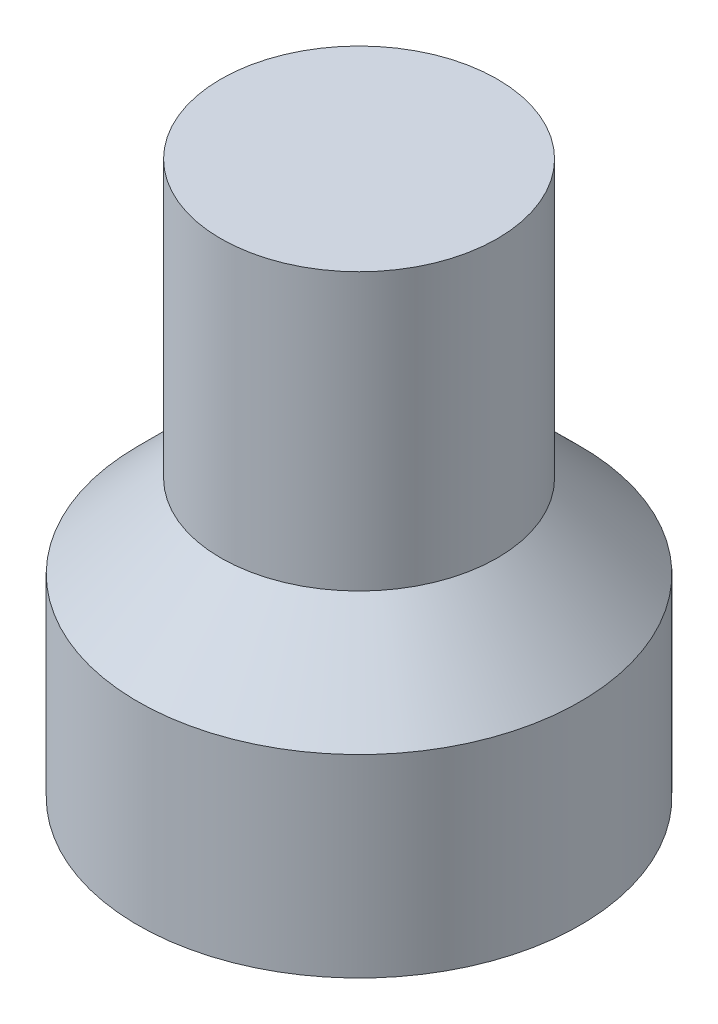
ISO-10303-21;
HEADER;
FILE_DESCRIPTION(('STEP AP214'),'2;1');
FILE_NAME('part.step','',(''),(''),'','','');
FILE_SCHEMA(('AUTOMOTIVE_DESIGN { 1 0 10303 214 1 1 1 1 }'));
ENDSEC;
DATA;
#1=APPLICATION_CONTEXT('core data for automotive mechanical design processes');
#2=APPLICATION_PROTOCOL_DEFINITION('international standard','automotive_design',2000,#1);
#3=PRODUCT_CONTEXT('',#1,'mechanical');
#4=PRODUCT('Part','Part','',(#3));
#5=PRODUCT_RELATED_PRODUCT_CATEGORY('part','',(#4));
#6=PRODUCT_DEFINITION_FORMATION('','',#4);
#7=PRODUCT_DEFINITION_CONTEXT('part definition',#1,'design');
#8=PRODUCT_DEFINITION('design','',#6,#7);
#9=PRODUCT_DEFINITION_SHAPE('','',#8);
#10=(LENGTH_UNIT() NAMED_UNIT(*) SI_UNIT(.MILLI.,.METRE.));
#11=(NAMED_UNIT(*) PLANE_ANGLE_UNIT() SI_UNIT($,.RADIAN.));
#12=(NAMED_UNIT(*) SI_UNIT($,.STERADIAN.) SOLID_ANGLE_UNIT());
#13=UNCERTAINTY_MEASURE_WITH_UNIT(LENGTH_MEASURE(1.E-05),#10,'distance_accuracy_value','');
#14=(GEOMETRIC_REPRESENTATION_CONTEXT(3) GLOBAL_UNCERTAINTY_ASSIGNED_CONTEXT((#13)) GLOBAL_UNIT_ASSIGNED_CONTEXT((#10,
#11,#12)) REPRESENTATION_CONTEXT('',''));
#15=CARTESIAN_POINT('',(0.,0.,0.));
#16=DIRECTION('',(0.,0.,1.));
#17=DIRECTION('',(1.,0.,0.));
#18=AXIS2_PLACEMENT_3D('',#15,#16,#17);
#19=CARTESIAN_POINT('',(0.,-10.,0.));
#20=DIRECTION('',(0.,-1.,0.));
#21=DIRECTION('',(1.,0.,0.));
#22=AXIS2_PLACEMENT_3D('',#19,#20,#21);
#23=PLANE('',#22);
#24=CARTESIAN_POINT('',(0.,-10.,0.));
#25=DIRECTION('',(0.,-1.,0.));
#26=DIRECTION('',(1.,0.,0.));
#27=AXIS2_PLACEMENT_3D('',#24,#25,#26);
#28=CIRCLE('',#27,5.1);
#29=CARTESIAN_POINT('',(5.1,-10.,0.));
#30=VERTEX_POINT('',#29);
#31=EDGE_CURVE('E65',#30,#30,#28,.T.);
#32=ORIENTED_EDGE('',*,*,#31,.F.);
#33=EDGE_LOOP('',(#32));
#34=FACE_BOUND('',#33,.T.);
#35=CARTESIAN_POINT('',(0.,-10.,0.));
#36=DIRECTION('',(0.,1.,0.));
#37=DIRECTION('',(-1.,0.,0.));
#38=AXIS2_PLACEMENT_3D('',#35,#36,#37);
#39=CIRCLE('',#38,8.);
#40=CARTESIAN_POINT('',(-8.,-10.,0.));
#41=VERTEX_POINT('',#40);
#42=EDGE_CURVE('E51',#41,#41,#39,.T.);
#43=ORIENTED_EDGE('',*,*,#42,.F.);
#44=EDGE_LOOP('',(#43));
#45=FACE_BOUND('',#44,.T.);
#46=ADVANCED_FACE('F43',(#34,#45),#23,.T.);
#47=CARTESIAN_POINT('',(0.,10.,0.));
#48=DIRECTION('',(0.,1.,0.));
#49=DIRECTION('',(-1.,0.,0.));
#50=AXIS2_PLACEMENT_3D('',#47,#48,#49);
#51=CYLINDRICAL_SURFACE('',#50,8.);
#52=CARTESIAN_POINT('',(0.,-3.00000000000001,0.));
#53=DIRECTION('',(0.,1.,0.));
#54=DIRECTION('',(-1.,0.,0.));
#55=AXIS2_PLACEMENT_3D('',#52,#53,#54);
#56=CIRCLE('',#55,8.);
#57=CARTESIAN_POINT('',(-8.,-3.00000000000001,0.));
#58=VERTEX_POINT('',#57);
#59=EDGE_CURVE('E11',#58,#58,#56,.F.);
#60=ORIENTED_EDGE('',*,*,#59,.T.);
#61=EDGE_LOOP('',(#60));
#62=FACE_BOUND('',#61,.T.);
#63=ORIENTED_EDGE('',*,*,#42,.T.);
#64=EDGE_LOOP('',(#63));
#65=FACE_BOUND('',#64,.T.);
#66=ADVANCED_FACE('F90',(#62,#65),#51,.T.);
#67=CARTESIAN_POINT('',(0.,10.,0.));
#68=DIRECTION('',(0.,1.,0.));
#69=DIRECTION('',(-1.,0.,0.));
#70=AXIS2_PLACEMENT_3D('',#67,#68,#69);
#71=CYLINDRICAL_SURFACE('',#70,5.);
#72=CARTESIAN_POINT('',(0.,0.,0.));
#73=DIRECTION('',(0.,1.,0.));
#74=DIRECTION('',(-1.,0.,0.));
#75=AXIS2_PLACEMENT_3D('',#72,#73,#74);
#76=CIRCLE('',#75,5.);
#77=CARTESIAN_POINT('',(-5.,0.,0.));
#78=VERTEX_POINT('',#77);
#79=EDGE_CURVE('E83',#78,#78,#76,.T.);
#80=ORIENTED_EDGE('',*,*,#79,.T.);
#81=EDGE_LOOP('',(#80));
#82=FACE_BOUND('',#81,.T.);
#83=CARTESIAN_POINT('',(0.,10.,0.));
#84=DIRECTION('',(0.,1.,0.));
#85=DIRECTION('',(-1.,0.,0.));
#86=AXIS2_PLACEMENT_3D('',#83,#84,#85);
#87=CIRCLE('',#86,5.);
#88=CARTESIAN_POINT('',(-5.,10.,0.));
#89=VERTEX_POINT('',#88);
#90=EDGE_CURVE('E78',#89,#89,#87,.T.);
#91=ORIENTED_EDGE('',*,*,#90,.F.);
#92=EDGE_LOOP('',(#91));
#93=FACE_BOUND('',#92,.T.);
#94=ADVANCED_FACE('F97',(#82,#93),#71,.T.);
#95=CARTESIAN_POINT('',(0.,10.,0.));
#96=DIRECTION('',(0.,1.,0.));
#97=DIRECTION('',(-1.,0.,0.));
#98=AXIS2_PLACEMENT_3D('',#95,#96,#97);
#99=PLANE('',#98);
#100=ORIENTED_EDGE('',*,*,#90,.T.);
#101=EDGE_LOOP('',(#100));
#102=FACE_BOUND('',#101,.T.);
#103=ADVANCED_FACE('F104',(#102),#99,.T.);
#104=CARTESIAN_POINT('',(0.,0.,0.));
#105=DIRECTION('',(0.,-1.,0.));
#106=DIRECTION('',(1.,0.,0.));
#107=AXIS2_PLACEMENT_3D('',#104,#105,#106);
#108=CONICAL_SURFACE('',#107,5.00000000000001,0.785398163397446);
#109=ORIENTED_EDGE('',*,*,#59,.F.);
#110=EDGE_LOOP('',(#109));
#111=FACE_BOUND('',#110,.T.);
#112=ORIENTED_EDGE('',*,*,#79,.F.);
#113=EDGE_LOOP('',(#112));
#114=FACE_BOUND('',#113,.T.);
#115=ADVANCED_FACE('F45',(#111,#114),#108,.T.);
#116=CARTESIAN_POINT('',(0.,-4.9,0.));
#117=DIRECTION('',(0.,-1.,0.));
#118=DIRECTION('',(1.,0.,0.));
#119=AXIS2_PLACEMENT_3D('',#116,#117,#118);
#120=CYLINDRICAL_SURFACE('',#119,5.1);
#121=CARTESIAN_POINT('',(0.,-4.9,0.));
#122=DIRECTION('',(0.,-1.,0.));
#123=DIRECTION('',(1.,0.,0.));
#124=AXIS2_PLACEMENT_3D('',#121,#122,#123);
#125=CIRCLE('',#124,5.1);
#126=CARTESIAN_POINT('',(5.1,-4.9,0.));
#127=VERTEX_POINT('',#126);
#128=EDGE_CURVE('E71',#127,#127,#125,.T.);
#129=ORIENTED_EDGE('',*,*,#128,.F.);
#130=EDGE_LOOP('',(#129));
#131=FACE_BOUND('',#130,.T.);
#132=ORIENTED_EDGE('',*,*,#31,.T.);
#133=EDGE_LOOP('',(#132));
#134=FACE_BOUND('',#133,.T.);
#135=ADVANCED_FACE('F109',(#131,#134),#120,.F.);
#136=CARTESIAN_POINT('',(0.,-4.9,0.));
#137=DIRECTION('',(0.,-1.,0.));
#138=DIRECTION('',(1.,0.,0.));
#139=AXIS2_PLACEMENT_3D('',#136,#137,#138);
#140=PLANE('',#139);
#141=CARTESIAN_POINT('',(0.,-4.9,0.));
#142=DIRECTION('',(0.,-1.,0.));
#143=DIRECTION('',(0.,0.,-1.));
#144=AXIS2_PLACEMENT_3D('',#141,#142,#143);
#145=CIRCLE('',#144,1.25);
#146=CARTESIAN_POINT('',(0.,-4.9,-1.25));
#147=VERTEX_POINT('',#146);
#148=EDGE_CURVE('E66',#147,#147,#145,.T.);
#149=ORIENTED_EDGE('',*,*,#148,.F.);
#150=EDGE_LOOP('',(#149));
#151=FACE_BOUND('',#150,.T.);
#152=ORIENTED_EDGE('',*,*,#128,.T.);
#153=EDGE_LOOP('',(#152));
#154=FACE_BOUND('',#153,.T.);
#155=ADVANCED_FACE('F58',(#151,#154),#140,.T.);
#156=CARTESIAN_POINT('',(0.,5.1,0.));
#157=DIRECTION('',(0.,-1.,0.));
#158=DIRECTION('',(0.,0.,-1.));
#159=AXIS2_PLACEMENT_3D('',#156,#157,#158);
#160=CONICAL_SURFACE('',#159,1.25,1.02974425867665);
#161=CARTESIAN_POINT('',(0.,5.85107577378445,0.));
#162=VERTEX_POINT('',#161);
#163=VERTEX_LOOP('',#162);
#164=FACE_BOUND('',#163,.T.);
#165=CARTESIAN_POINT('',(0.,5.1,0.));
#166=DIRECTION('',(0.,-1.,0.));
#167=DIRECTION('',(0.,0.,-1.));
#168=AXIS2_PLACEMENT_3D('',#165,#166,#167);
#169=CIRCLE('',#168,1.25);
#170=CARTESIAN_POINT('',(0.,5.1,-1.25));
#171=VERTEX_POINT('',#170);
#172=EDGE_CURVE('E62',#171,#171,#169,.T.);
#173=ORIENTED_EDGE('',*,*,#172,.T.);
#174=EDGE_LOOP('',(#173));
#175=FACE_BOUND('',#174,.T.);
#176=ADVANCED_FACE('F54',(#164,#175),#160,.F.);
#177=CARTESIAN_POINT('',(0.,-4.9,0.));
#178=DIRECTION('',(0.,-1.,0.));
#179=DIRECTION('',(0.,0.,-1.));
#180=AXIS2_PLACEMENT_3D('',#177,#178,#179);
#181=CYLINDRICAL_SURFACE('',#180,1.25);
#182=ORIENTED_EDGE('',*,*,#172,.F.);
#183=EDGE_LOOP('',(#182));
#184=FACE_BOUND('',#183,.T.);
#185=ORIENTED_EDGE('',*,*,#148,.T.);
#186=EDGE_LOOP('',(#185));
#187=FACE_BOUND('',#186,.T.);
#188=ADVANCED_FACE('F57',(#184,#187),#181,.F.);
#189=CLOSED_SHELL('',(#46,#66,#94,#103,#115,#135,#155,#176,#188));
#190=MANIFOLD_SOLID_BREP('B2',#189);
#191=ADVANCED_BREP_SHAPE_REPRESENTATION('',(#18,#190),#14);
#192=SHAPE_DEFINITION_REPRESENTATION(#9,#191);
ENDSEC;
END-ISO-10303-21;
